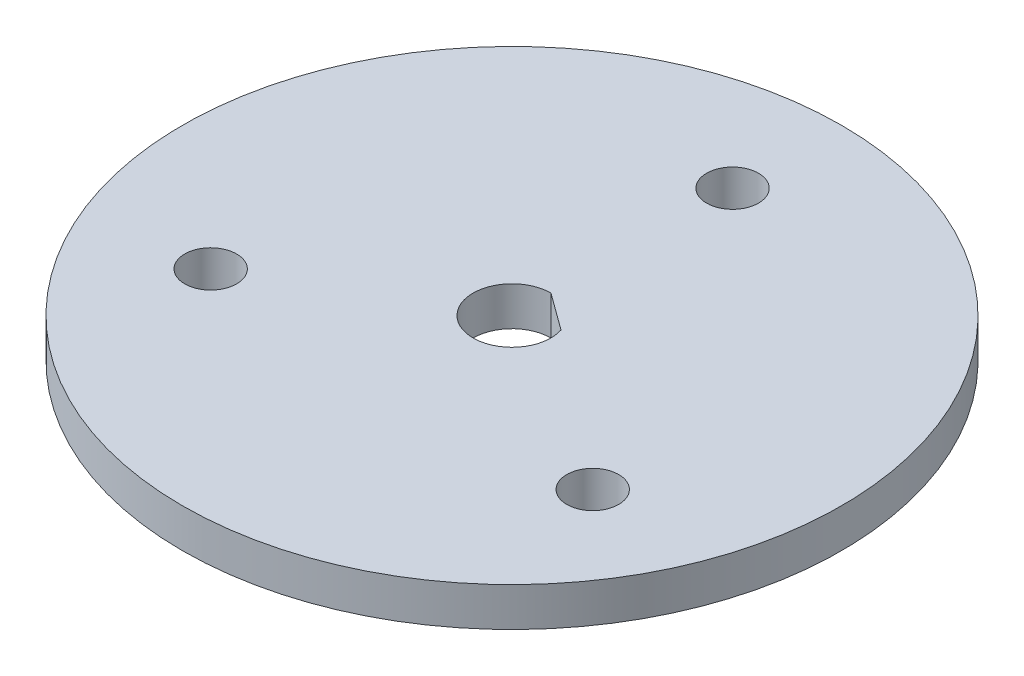
ISO-10303-21;
HEADER;
FILE_DESCRIPTION(('STEP AP214'),'2;1');
FILE_NAME('part.step','',(''),(''),'','','');
FILE_SCHEMA(('AUTOMOTIVE_DESIGN { 1 0 10303 214 1 1 1 1 }'));
ENDSEC;
DATA;
#1=APPLICATION_CONTEXT('core data for automotive mechanical design processes');
#2=APPLICATION_PROTOCOL_DEFINITION('international standard','automotive_design',2000,#1);
#3=PRODUCT_CONTEXT('',#1,'mechanical');
#4=PRODUCT('Part','Part','',(#3));
#5=PRODUCT_RELATED_PRODUCT_CATEGORY('part','',(#4));
#6=PRODUCT_DEFINITION_FORMATION('','',#4);
#7=PRODUCT_DEFINITION_CONTEXT('part definition',#1,'design');
#8=PRODUCT_DEFINITION('design','',#6,#7);
#9=PRODUCT_DEFINITION_SHAPE('','',#8);
#10=(LENGTH_UNIT() NAMED_UNIT(*) SI_UNIT(.MILLI.,.METRE.));
#11=(NAMED_UNIT(*) PLANE_ANGLE_UNIT() SI_UNIT($,.RADIAN.));
#12=(NAMED_UNIT(*) SI_UNIT($,.STERADIAN.) SOLID_ANGLE_UNIT());
#13=UNCERTAINTY_MEASURE_WITH_UNIT(LENGTH_MEASURE(1.E-05),#10,'distance_accuracy_value','');
#14=(GEOMETRIC_REPRESENTATION_CONTEXT(3) GLOBAL_UNCERTAINTY_ASSIGNED_CONTEXT((#13)) GLOBAL_UNIT_ASSIGNED_CONTEXT((#10,
#11,#12)) REPRESENTATION_CONTEXT('',''));
#15=CARTESIAN_POINT('',(0.,0.,0.));
#16=DIRECTION('',(0.,0.,1.));
#17=DIRECTION('',(1.,0.,0.));
#18=AXIS2_PLACEMENT_3D('',#15,#16,#17);
#19=CARTESIAN_POINT('',(0.,3.,0.));
#20=DIRECTION('',(0.,1.,0.));
#21=DIRECTION('',(0.,0.,1.));
#22=AXIS2_PLACEMENT_3D('',#19,#20,#21);
#23=PLANE('',#22);
#24=CARTESIAN_POINT('',(-14.7224318643344,3.,8.50000000000063));
#25=DIRECTION('',(0.,1.,0.));
#26=DIRECTION('',(0.,0.,1.));
#27=AXIS2_PLACEMENT_3D('',#24,#25,#26);
#28=CIRCLE('',#27,2.00000000000138);
#29=CARTESIAN_POINT('',(-14.7224318643344,3.,10.500000000002));
#30=VERTEX_POINT('',#29);
#31=EDGE_CURVE('E90',#30,#30,#28,.T.);
#32=ORIENTED_EDGE('',*,*,#31,.F.);
#33=EDGE_LOOP('',(#32));
#34=FACE_BOUND('',#33,.T.);
#35=CARTESIAN_POINT('',(0.,3.,-17.));
#36=DIRECTION('',(0.,1.,0.));
#37=DIRECTION('',(0.,0.,1.));
#38=AXIS2_PLACEMENT_3D('',#35,#36,#37);
#39=CIRCLE('',#38,2.);
#40=CARTESIAN_POINT('',(0.,3.,-15.));
#41=VERTEX_POINT('',#40);
#42=EDGE_CURVE('E180',#41,#41,#39,.T.);
#43=ORIENTED_EDGE('',*,*,#42,.F.);
#44=EDGE_LOOP('',(#43));
#45=FACE_BOUND('',#44,.T.);
#46=CARTESIAN_POINT('',(14.7224318643365,3.,8.49999999999936));
#47=DIRECTION('',(0.,1.,0.));
#48=DIRECTION('',(0.,0.,1.));
#49=AXIS2_PLACEMENT_3D('',#46,#47,#48);
#50=CIRCLE('',#49,2.00000000000095);
#51=CARTESIAN_POINT('',(14.7224318643365,3.,10.5000000000003));
#52=VERTEX_POINT('',#51);
#53=EDGE_CURVE('E78',#52,#52,#50,.T.);
#54=ORIENTED_EDGE('',*,*,#53,.F.);
#55=EDGE_LOOP('',(#54));
#56=FACE_BOUND('',#55,.T.);
#57=CARTESIAN_POINT('',(0.,3.,0.));
#58=DIRECTION('',(0.,1.,0.));
#59=DIRECTION('',(0.,0.,1.));
#60=AXIS2_PLACEMENT_3D('',#57,#58,#59);
#61=CIRCLE('',#60,25.4);
#62=CARTESIAN_POINT('',(0.,3.,25.4));
#63=VERTEX_POINT('',#62);
#64=EDGE_CURVE('E82',#63,#63,#61,.T.);
#65=ORIENTED_EDGE('',*,*,#64,.T.);
#66=EDGE_LOOP('',(#65));
#67=FACE_BOUND('',#66,.T.);
#68=CARTESIAN_POINT('',(0.,3.,0.));
#69=DIRECTION('',(0.,1.,0.));
#70=DIRECTION('',(0.,0.,1.));
#71=AXIS2_PLACEMENT_3D('',#68,#69,#70);
#72=CIRCLE('',#71,3.);
#73=CARTESIAN_POINT('',(0.,3.,-3.));
#74=VERTEX_POINT('',#73);
#75=CARTESIAN_POINT('',(2.85442332758397,3.,-0.923183333333334));
#76=VERTEX_POINT('',#75);
#77=EDGE_CURVE('E70',#74,#76,#72,.T.);
#78=ORIENTED_EDGE('',*,*,#77,.F.);
#79=DIRECTION('',(0.808618506397726,0.,0.588333333333333));
#80=VECTOR('',#79,1.);
#81=CARTESIAN_POINT('',(1.42721166379199,3.,-1.96159166666667));
#82=LINE('',#81,#80);
#83=EDGE_CURVE('E52',#74,#76,#82,.T.);
#84=ORIENTED_EDGE('',*,*,#83,.T.);
#85=EDGE_LOOP('',(#78,#84));
#86=FACE_BOUND('',#85,.T.);
#87=ADVANCED_FACE('F35',(#34,#45,#56,#67,#86),#23,.T.);
#88=CARTESIAN_POINT('',(0.,0.,0.));
#89=DIRECTION('',(0.,1.,0.));
#90=DIRECTION('',(0.,0.,1.));
#91=AXIS2_PLACEMENT_3D('',#88,#89,#90);
#92=PLANE('',#91);
#93=CARTESIAN_POINT('',(-14.7224318643344,0.,8.50000000000063));
#94=DIRECTION('',(0.,1.,0.));
#95=DIRECTION('',(0.,0.,1.));
#96=AXIS2_PLACEMENT_3D('',#93,#94,#95);
#97=CIRCLE('',#96,2.00000000000138);
#98=CARTESIAN_POINT('',(-14.7224318643344,0.,10.500000000002));
#99=VERTEX_POINT('',#98);
#100=EDGE_CURVE('E39',#99,#99,#97,.T.);
#101=ORIENTED_EDGE('',*,*,#100,.T.);
#102=EDGE_LOOP('',(#101));
#103=FACE_BOUND('',#102,.T.);
#104=CARTESIAN_POINT('',(0.,0.,-17.));
#105=DIRECTION('',(0.,1.,0.));
#106=DIRECTION('',(0.,0.,1.));
#107=AXIS2_PLACEMENT_3D('',#104,#105,#106);
#108=CIRCLE('',#107,2.);
#109=CARTESIAN_POINT('',(0.,0.,-15.));
#110=VERTEX_POINT('',#109);
#111=EDGE_CURVE('E76',#110,#110,#108,.T.);
#112=ORIENTED_EDGE('',*,*,#111,.T.);
#113=EDGE_LOOP('',(#112));
#114=FACE_BOUND('',#113,.T.);
#115=CARTESIAN_POINT('',(14.7224318643365,0.,8.49999999999936));
#116=DIRECTION('',(0.,1.,0.));
#117=DIRECTION('',(0.,0.,1.));
#118=AXIS2_PLACEMENT_3D('',#115,#116,#117);
#119=CIRCLE('',#118,2.00000000000095);
#120=CARTESIAN_POINT('',(14.7224318643365,0.,10.5000000000003));
#121=VERTEX_POINT('',#120);
#122=EDGE_CURVE('E88',#121,#121,#119,.T.);
#123=ORIENTED_EDGE('',*,*,#122,.T.);
#124=EDGE_LOOP('',(#123));
#125=FACE_BOUND('',#124,.T.);
#126=CARTESIAN_POINT('',(0.,0.,0.));
#127=DIRECTION('',(0.,1.,0.));
#128=DIRECTION('',(0.,0.,1.));
#129=AXIS2_PLACEMENT_3D('',#126,#127,#128);
#130=CIRCLE('',#129,25.4);
#131=CARTESIAN_POINT('',(0.,0.,25.4));
#132=VERTEX_POINT('',#131);
#133=EDGE_CURVE('E66',#132,#132,#130,.T.);
#134=ORIENTED_EDGE('',*,*,#133,.F.);
#135=EDGE_LOOP('',(#134));
#136=FACE_BOUND('',#135,.T.);
#137=DIRECTION('',(0.808618506397726,0.,0.588333333333333));
#138=VECTOR('',#137,1.);
#139=CARTESIAN_POINT('',(1.42721166379199,0.,-1.96159166666667));
#140=LINE('',#139,#138);
#141=CARTESIAN_POINT('',(0.,0.,-3.));
#142=VERTEX_POINT('',#141);
#143=CARTESIAN_POINT('',(2.85442332758397,0.,-0.923183333333334));
#144=VERTEX_POINT('',#143);
#145=EDGE_CURVE('E11',#142,#144,#140,.T.);
#146=ORIENTED_EDGE('',*,*,#145,.F.);
#147=CARTESIAN_POINT('',(0.,0.,0.));
#148=DIRECTION('',(0.,1.,0.));
#149=DIRECTION('',(0.,0.,1.));
#150=AXIS2_PLACEMENT_3D('',#147,#148,#149);
#151=CIRCLE('',#150,3.);
#152=EDGE_CURVE('E44',#142,#144,#151,.T.);
#153=ORIENTED_EDGE('',*,*,#152,.T.);
#154=EDGE_LOOP('',(#146,#153));
#155=FACE_BOUND('',#154,.T.);
#156=ADVANCED_FACE('F94',(#103,#114,#125,#136,#155),#92,.F.);
#157=CARTESIAN_POINT('',(0.,3.,0.));
#158=DIRECTION('',(0.,-1.,0.));
#159=DIRECTION('',(0.,0.,-1.));
#160=AXIS2_PLACEMENT_3D('',#157,#158,#159);
#161=CYLINDRICAL_SURFACE('',#160,25.4);
#162=ORIENTED_EDGE('',*,*,#64,.F.);
#163=EDGE_LOOP('',(#162));
#164=FACE_BOUND('',#163,.T.);
#165=ORIENTED_EDGE('',*,*,#133,.T.);
#166=EDGE_LOOP('',(#165));
#167=FACE_BOUND('',#166,.T.);
#168=ADVANCED_FACE('F37',(#164,#167),#161,.T.);
#169=CARTESIAN_POINT('',(1.42721166379199,-2.,-1.96159166666667));
#170=DIRECTION('',(-0.588333333333333,0.,0.808618506397726));
#171=DIRECTION('',(0.808618506397726,0.,0.588333333333333));
#172=AXIS2_PLACEMENT_3D('',#169,#170,#171);
#173=PLANE('',#172);
#174=ORIENTED_EDGE('',*,*,#145,.T.);
#175=DIRECTION('',(0.,1.,0.));
#176=VECTOR('',#175,1.);
#177=CARTESIAN_POINT('',(2.85442332758397,-2.,-0.923183333333334));
#178=LINE('',#177,#176);
#179=EDGE_CURVE('E59',#144,#76,#178,.T.);
#180=ORIENTED_EDGE('',*,*,#179,.T.);
#181=ORIENTED_EDGE('',*,*,#83,.F.);
#182=DIRECTION('',(0.,1.,0.));
#183=VECTOR('',#182,1.);
#184=CARTESIAN_POINT('',(0.,-2.,-3.));
#185=LINE('',#184,#183);
#186=EDGE_CURVE('E67',#142,#74,#185,.T.);
#187=ORIENTED_EDGE('',*,*,#186,.F.);
#188=EDGE_LOOP('',(#174,#180,#181,#187));
#189=FACE_BOUND('',#188,.T.);
#190=ADVANCED_FACE('F63',(#189),#173,.T.);
#191=CARTESIAN_POINT('',(0.,-2.,0.));
#192=DIRECTION('',(0.,1.,0.));
#193=DIRECTION('',(0.,0.,1.));
#194=AXIS2_PLACEMENT_3D('',#191,#192,#193);
#195=CYLINDRICAL_SURFACE('',#194,3.);
#196=ORIENTED_EDGE('',*,*,#186,.T.);
#197=ORIENTED_EDGE('',*,*,#77,.T.);
#198=ORIENTED_EDGE('',*,*,#179,.F.);
#199=ORIENTED_EDGE('',*,*,#152,.F.);
#200=EDGE_LOOP('',(#196,#197,#198,#199));
#201=FACE_BOUND('',#200,.T.);
#202=ADVANCED_FACE('F71',(#201),#195,.F.);
#203=CARTESIAN_POINT('',(14.7224318643365,-2.,8.49999999999936));
#204=DIRECTION('',(0.,1.,0.));
#205=DIRECTION('',(0.,0.,1.));
#206=AXIS2_PLACEMENT_3D('',#203,#204,#205);
#207=CYLINDRICAL_SURFACE('',#206,2.00000000000095);
#208=ORIENTED_EDGE('',*,*,#53,.T.);
#209=EDGE_LOOP('',(#208));
#210=FACE_BOUND('',#209,.T.);
#211=ORIENTED_EDGE('',*,*,#122,.F.);
#212=EDGE_LOOP('',(#211));
#213=FACE_BOUND('',#212,.T.);
#214=ADVANCED_FACE('F100',(#210,#213),#207,.F.);
#215=CARTESIAN_POINT('',(0.,-2.,-17.));
#216=DIRECTION('',(0.,1.,0.));
#217=DIRECTION('',(0.,0.,1.));
#218=AXIS2_PLACEMENT_3D('',#215,#216,#217);
#219=CYLINDRICAL_SURFACE('',#218,2.);
#220=ORIENTED_EDGE('',*,*,#42,.T.);
#221=EDGE_LOOP('',(#220));
#222=FACE_BOUND('',#221,.T.);
#223=ORIENTED_EDGE('',*,*,#111,.F.);
#224=EDGE_LOOP('',(#223));
#225=FACE_BOUND('',#224,.T.);
#226=ADVANCED_FACE('F97',(#222,#225),#219,.F.);
#227=CARTESIAN_POINT('',(-14.7224318643344,-2.,8.50000000000063));
#228=DIRECTION('',(0.,1.,0.));
#229=DIRECTION('',(0.,0.,1.));
#230=AXIS2_PLACEMENT_3D('',#227,#228,#229);
#231=CYLINDRICAL_SURFACE('',#230,2.00000000000138);
#232=ORIENTED_EDGE('',*,*,#31,.T.);
#233=EDGE_LOOP('',(#232));
#234=FACE_BOUND('',#233,.T.);
#235=ORIENTED_EDGE('',*,*,#100,.F.);
#236=EDGE_LOOP('',(#235));
#237=FACE_BOUND('',#236,.T.);
#238=ADVANCED_FACE('F99',(#234,#237),#231,.F.);
#239=CLOSED_SHELL('',(#87,#156,#168,#190,#202,#214,#226,#238));
#240=MANIFOLD_SOLID_BREP('B2',#239);
#241=ADVANCED_BREP_SHAPE_REPRESENTATION('',(#18,#240),#14);
#242=SHAPE_DEFINITION_REPRESENTATION(#9,#241);
ENDSEC;
END-ISO-10303-21;
